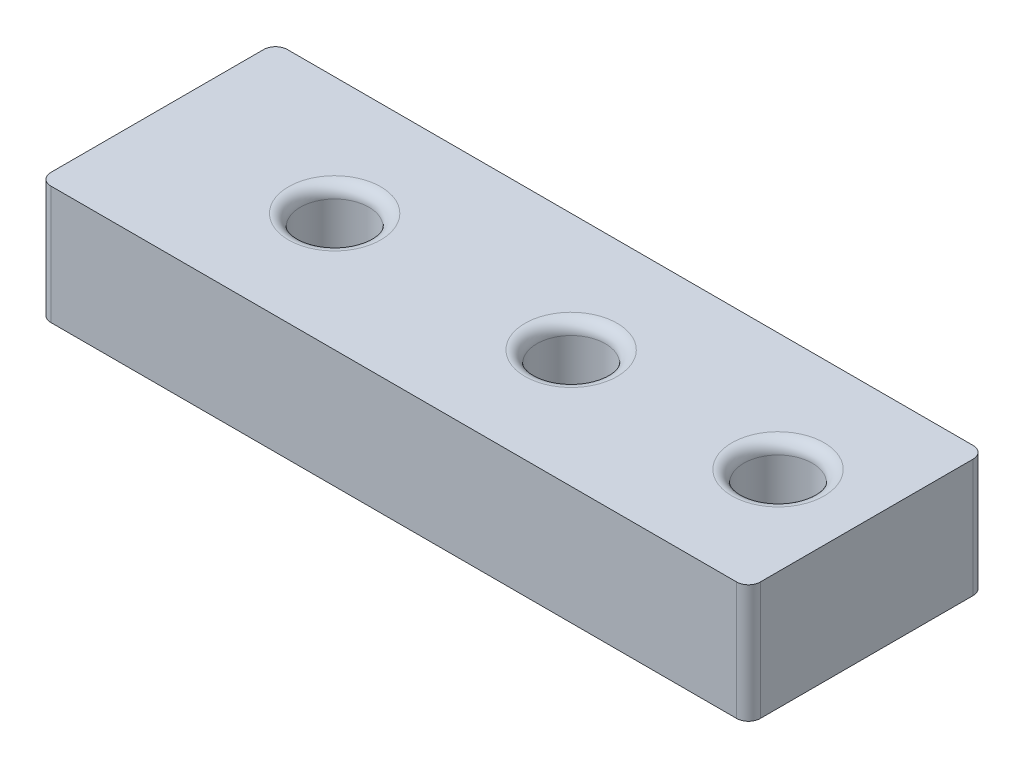
ISO-10303-21;
HEADER;
FILE_DESCRIPTION(('STEP AP214'),'2;1');
FILE_NAME('part.step','',(''),(''),'','','');
FILE_SCHEMA(('AUTOMOTIVE_DESIGN { 1 0 10303 214 1 1 1 1 }'));
ENDSEC;
DATA;
#1=APPLICATION_CONTEXT('core data for automotive mechanical design processes');
#2=APPLICATION_PROTOCOL_DEFINITION('international standard','automotive_design',2000,#1);
#3=PRODUCT_CONTEXT('',#1,'mechanical');
#4=PRODUCT('Part','Part','',(#3));
#5=PRODUCT_RELATED_PRODUCT_CATEGORY('part','',(#4));
#6=PRODUCT_DEFINITION_FORMATION('','',#4);
#7=PRODUCT_DEFINITION_CONTEXT('part definition',#1,'design');
#8=PRODUCT_DEFINITION('design','',#6,#7);
#9=PRODUCT_DEFINITION_SHAPE('','',#8);
#10=(LENGTH_UNIT() NAMED_UNIT(*) SI_UNIT(.MILLI.,.METRE.));
#11=(NAMED_UNIT(*) PLANE_ANGLE_UNIT() SI_UNIT($,.RADIAN.));
#12=(NAMED_UNIT(*) SI_UNIT($,.STERADIAN.) SOLID_ANGLE_UNIT());
#13=UNCERTAINTY_MEASURE_WITH_UNIT(LENGTH_MEASURE(1.E-05),#10,'distance_accuracy_value','');
#14=(GEOMETRIC_REPRESENTATION_CONTEXT(3) GLOBAL_UNCERTAINTY_ASSIGNED_CONTEXT((#13)) GLOBAL_UNIT_ASSIGNED_CONTEXT((#10,
#11,#12)) REPRESENTATION_CONTEXT('',''));
#15=CARTESIAN_POINT('',(0.,0.,0.));
#16=DIRECTION('',(0.,0.,1.));
#17=DIRECTION('',(1.,0.,0.));
#18=AXIS2_PLACEMENT_3D('',#15,#16,#17);
#19=CARTESIAN_POINT('',(38.1,12.7,-12.7));
#20=DIRECTION('',(-1.,0.,0.));
#21=DIRECTION('',(0.,0.,1.));
#22=AXIS2_PLACEMENT_3D('',#19,#20,#21);
#23=PLANE('',#22);
#24=DIRECTION('',(0.,0.,-1.));
#25=VECTOR('',#24,1.);
#26=CARTESIAN_POINT('',(38.1,0.,-12.7));
#27=LINE('',#26,#25);
#28=CARTESIAN_POINT('',(38.1,0.,11.43));
#29=VERTEX_POINT('',#28);
#30=CARTESIAN_POINT('',(38.1,0.,-11.43));
#31=VERTEX_POINT('',#30);
#32=EDGE_CURVE('E208',#29,#31,#27,.T.);
#33=ORIENTED_EDGE('',*,*,#32,.T.);
#34=DIRECTION('',(0.,-1.,0.));
#35=VECTOR('',#34,1.);
#36=CARTESIAN_POINT('',(38.1,12.7,-11.43));
#37=LINE('',#36,#35);
#38=CARTESIAN_POINT('',(38.1,12.7,-11.43));
#39=VERTEX_POINT('',#38);
#40=EDGE_CURVE('E119',#31,#39,#37,.F.);
#41=ORIENTED_EDGE('',*,*,#40,.T.);
#42=DIRECTION('',(0.,0.,-1.));
#43=VECTOR('',#42,1.);
#44=CARTESIAN_POINT('',(38.1,12.7,-12.7));
#45=LINE('',#44,#43);
#46=CARTESIAN_POINT('',(38.1,12.7,11.43));
#47=VERTEX_POINT('',#46);
#48=EDGE_CURVE('E104',#47,#39,#45,.T.);
#49=ORIENTED_EDGE('',*,*,#48,.F.);
#50=DIRECTION('',(0.,-1.,0.));
#51=VECTOR('',#50,1.);
#52=CARTESIAN_POINT('',(38.1,12.7,11.43));
#53=LINE('',#52,#51);
#54=EDGE_CURVE('E117',#47,#29,#53,.T.);
#55=ORIENTED_EDGE('',*,*,#54,.T.);
#56=EDGE_LOOP('',(#33,#41,#49,#55));
#57=FACE_BOUND('',#56,.T.);
#58=ADVANCED_FACE('F33',(#57),#23,.F.);
#59=CARTESIAN_POINT('',(-38.1,12.7,-12.7));
#60=DIRECTION('',(0.,0.,1.));
#61=DIRECTION('',(1.,0.,0.));
#62=AXIS2_PLACEMENT_3D('',#59,#60,#61);
#63=PLANE('',#62);
#64=DIRECTION('',(-1.,0.,0.));
#65=VECTOR('',#64,1.);
#66=CARTESIAN_POINT('',(-38.1,12.7,-12.7));
#67=LINE('',#66,#65);
#68=CARTESIAN_POINT('',(36.83,12.7,-12.7));
#69=VERTEX_POINT('',#68);
#70=CARTESIAN_POINT('',(-36.83,12.7,-12.7));
#71=VERTEX_POINT('',#70);
#72=EDGE_CURVE('E120',#69,#71,#67,.T.);
#73=ORIENTED_EDGE('',*,*,#72,.F.);
#74=DIRECTION('',(0.,-1.,0.));
#75=VECTOR('',#74,1.);
#76=CARTESIAN_POINT('',(36.83,12.7,-12.7));
#77=LINE('',#76,#75);
#78=CARTESIAN_POINT('',(36.83,0.,-12.7));
#79=VERTEX_POINT('',#78);
#80=EDGE_CURVE('E125',#69,#79,#77,.T.);
#81=ORIENTED_EDGE('',*,*,#80,.T.);
#82=DIRECTION('',(-1.,0.,0.));
#83=VECTOR('',#82,1.);
#84=CARTESIAN_POINT('',(-38.1,0.,-12.7));
#85=LINE('',#84,#83);
#86=CARTESIAN_POINT('',(-36.83,0.,-12.7));
#87=VERTEX_POINT('',#86);
#88=EDGE_CURVE('E199',#79,#87,#85,.T.);
#89=ORIENTED_EDGE('',*,*,#88,.T.);
#90=DIRECTION('',(0.,-1.,0.));
#91=VECTOR('',#90,1.);
#92=CARTESIAN_POINT('',(-36.83,12.7,-12.7));
#93=LINE('',#92,#91);
#94=EDGE_CURVE('E129',#87,#71,#93,.F.);
#95=ORIENTED_EDGE('',*,*,#94,.T.);
#96=EDGE_LOOP('',(#73,#81,#89,#95));
#97=FACE_BOUND('',#96,.T.);
#98=ADVANCED_FACE('F198',(#97),#63,.F.);
#99=CARTESIAN_POINT('',(-38.1,12.7,-12.7));
#100=DIRECTION('',(1.,0.,0.));
#101=DIRECTION('',(0.,0.,-1.));
#102=AXIS2_PLACEMENT_3D('',#99,#100,#101);
#103=PLANE('',#102);
#104=DIRECTION('',(0.,0.,1.));
#105=VECTOR('',#104,1.);
#106=CARTESIAN_POINT('',(-38.1,12.7,-12.7));
#107=LINE('',#106,#105);
#108=CARTESIAN_POINT('',(-38.1,12.7,-11.43));
#109=VERTEX_POINT('',#108);
#110=CARTESIAN_POINT('',(-38.1,12.7,11.43));
#111=VERTEX_POINT('',#110);
#112=EDGE_CURVE('E142',#109,#111,#107,.T.);
#113=ORIENTED_EDGE('',*,*,#112,.F.);
#114=DIRECTION('',(0.,-1.,0.));
#115=VECTOR('',#114,1.);
#116=CARTESIAN_POINT('',(-38.1,12.7,-11.43));
#117=LINE('',#116,#115);
#118=CARTESIAN_POINT('',(-38.1,0.,-11.43));
#119=VERTEX_POINT('',#118);
#120=EDGE_CURVE('E11',#109,#119,#117,.T.);
#121=ORIENTED_EDGE('',*,*,#120,.T.);
#122=DIRECTION('',(0.,0.,1.));
#123=VECTOR('',#122,1.);
#124=CARTESIAN_POINT('',(-38.1,0.,-12.7));
#125=LINE('',#124,#123);
#126=CARTESIAN_POINT('',(-38.1,0.,11.43));
#127=VERTEX_POINT('',#126);
#128=EDGE_CURVE('E144',#119,#127,#125,.T.);
#129=ORIENTED_EDGE('',*,*,#128,.T.);
#130=DIRECTION('',(0.,-1.,0.));
#131=VECTOR('',#130,1.);
#132=CARTESIAN_POINT('',(-38.1,12.7,11.43));
#133=LINE('',#132,#131);
#134=EDGE_CURVE('E41',#127,#111,#133,.F.);
#135=ORIENTED_EDGE('',*,*,#134,.T.);
#136=EDGE_LOOP('',(#113,#121,#129,#135));
#137=FACE_BOUND('',#136,.T.);
#138=ADVANCED_FACE('F141',(#137),#103,.F.);
#139=CARTESIAN_POINT('',(-38.1,12.7,12.7));
#140=DIRECTION('',(0.,0.,-1.));
#141=DIRECTION('',(-1.,0.,0.));
#142=AXIS2_PLACEMENT_3D('',#139,#140,#141);
#143=PLANE('',#142);
#144=DIRECTION('',(1.,0.,0.));
#145=VECTOR('',#144,1.);
#146=CARTESIAN_POINT('',(-38.1,0.,12.7));
#147=LINE('',#146,#145);
#148=CARTESIAN_POINT('',(-36.83,0.,12.7));
#149=VERTEX_POINT('',#148);
#150=CARTESIAN_POINT('',(36.83,0.,12.7));
#151=VERTEX_POINT('',#150);
#152=EDGE_CURVE('E121',#149,#151,#147,.T.);
#153=ORIENTED_EDGE('',*,*,#152,.T.);
#154=DIRECTION('',(0.,-1.,0.));
#155=VECTOR('',#154,1.);
#156=CARTESIAN_POINT('',(36.83,12.7,12.7));
#157=LINE('',#156,#155);
#158=CARTESIAN_POINT('',(36.83,12.7,12.7));
#159=VERTEX_POINT('',#158);
#160=EDGE_CURVE('E135',#151,#159,#157,.F.);
#161=ORIENTED_EDGE('',*,*,#160,.T.);
#162=DIRECTION('',(1.,0.,0.));
#163=VECTOR('',#162,1.);
#164=CARTESIAN_POINT('',(-38.1,12.7,12.7));
#165=LINE('',#164,#163);
#166=CARTESIAN_POINT('',(-36.83,12.7,12.7));
#167=VERTEX_POINT('',#166);
#168=EDGE_CURVE('E107',#167,#159,#165,.T.);
#169=ORIENTED_EDGE('',*,*,#168,.F.);
#170=DIRECTION('',(0.,-1.,0.));
#171=VECTOR('',#170,1.);
#172=CARTESIAN_POINT('',(-36.83,12.7,12.7));
#173=LINE('',#172,#171);
#174=EDGE_CURVE('E127',#167,#149,#173,.T.);
#175=ORIENTED_EDGE('',*,*,#174,.T.);
#176=EDGE_LOOP('',(#153,#161,#169,#175));
#177=FACE_BOUND('',#176,.T.);
#178=ADVANCED_FACE('F278',(#177),#143,.F.);
#179=CARTESIAN_POINT('',(0.,12.7,0.));
#180=DIRECTION('',(0.,1.,0.));
#181=DIRECTION('',(0.,0.,1.));
#182=AXIS2_PLACEMENT_3D('',#179,#180,#181);
#183=PLANE('',#182);
#184=CARTESIAN_POINT('',(-19.05,12.7,0.));
#185=DIRECTION('',(0.,1.,0.));
#186=DIRECTION('',(0.,0.,1.));
#187=AXIS2_PLACEMENT_3D('',#184,#185,#186);
#188=CIRCLE('',#187,4.95299999999999);
#189=CARTESIAN_POINT('',(-19.05,12.7,4.95299999999999));
#190=VERTEX_POINT('',#189);
#191=EDGE_CURVE('E167',#190,#190,#188,.F.);
#192=ORIENTED_EDGE('',*,*,#191,.T.);
#193=EDGE_LOOP('',(#192));
#194=FACE_BOUND('',#193,.T.);
#195=CARTESIAN_POINT('',(6.35,12.7,0.));
#196=DIRECTION('',(0.,1.,0.));
#197=DIRECTION('',(0.,0.,1.));
#198=AXIS2_PLACEMENT_3D('',#195,#196,#197);
#199=CIRCLE('',#198,4.95299999999999);
#200=CARTESIAN_POINT('',(6.35,12.7,4.95299999999999));
#201=VERTEX_POINT('',#200);
#202=EDGE_CURVE('E164',#201,#201,#199,.F.);
#203=ORIENTED_EDGE('',*,*,#202,.T.);
#204=EDGE_LOOP('',(#203));
#205=FACE_BOUND('',#204,.T.);
#206=CARTESIAN_POINT('',(28.575,12.7,0.));
#207=DIRECTION('',(0.,1.,0.));
#208=DIRECTION('',(0.,0.,1.));
#209=AXIS2_PLACEMENT_3D('',#206,#207,#208);
#210=CIRCLE('',#209,4.95299999999999);
#211=CARTESIAN_POINT('',(28.575,12.7,4.95299999999999));
#212=VERTEX_POINT('',#211);
#213=EDGE_CURVE('E161',#212,#212,#210,.F.);
#214=ORIENTED_EDGE('',*,*,#213,.T.);
#215=EDGE_LOOP('',(#214));
#216=FACE_BOUND('',#215,.T.);
#217=ORIENTED_EDGE('',*,*,#48,.T.);
#218=CARTESIAN_POINT('',(36.83,12.7,-11.43));
#219=DIRECTION('',(0.,1.,0.));
#220=DIRECTION('',(0.,0.,1.));
#221=AXIS2_PLACEMENT_3D('',#218,#219,#220);
#222=CIRCLE('',#221,1.27);
#223=EDGE_CURVE('E111',#39,#69,#222,.T.);
#224=ORIENTED_EDGE('',*,*,#223,.T.);
#225=ORIENTED_EDGE('',*,*,#72,.T.);
#226=CARTESIAN_POINT('',(-36.83,12.7,-11.43));
#227=DIRECTION('',(0.,1.,0.));
#228=DIRECTION('',(0.,0.,1.));
#229=AXIS2_PLACEMENT_3D('',#226,#227,#228);
#230=CIRCLE('',#229,1.27);
#231=EDGE_CURVE('E112',#71,#109,#230,.T.);
#232=ORIENTED_EDGE('',*,*,#231,.T.);
#233=ORIENTED_EDGE('',*,*,#112,.T.);
#234=CARTESIAN_POINT('',(-36.83,12.7,11.43));
#235=DIRECTION('',(0.,1.,0.));
#236=DIRECTION('',(0.,0.,1.));
#237=AXIS2_PLACEMENT_3D('',#234,#235,#236);
#238=CIRCLE('',#237,1.27);
#239=EDGE_CURVE('E147',#111,#167,#238,.T.);
#240=ORIENTED_EDGE('',*,*,#239,.T.);
#241=ORIENTED_EDGE('',*,*,#168,.T.);
#242=CARTESIAN_POINT('',(36.83,12.7,11.43));
#243=DIRECTION('',(0.,1.,0.));
#244=DIRECTION('',(0.,0.,1.));
#245=AXIS2_PLACEMENT_3D('',#242,#243,#244);
#246=CIRCLE('',#245,1.27);
#247=EDGE_CURVE('E101',#159,#47,#246,.T.);
#248=ORIENTED_EDGE('',*,*,#247,.T.);
#249=EDGE_LOOP('',(#217,#224,#225,#232,#233,#240,#241,#248));
#250=FACE_BOUND('',#249,.T.);
#251=ADVANCED_FACE('F103',(#194,#205,#216,#250),#183,.T.);
#252=CARTESIAN_POINT('',(0.,0.,0.));
#253=DIRECTION('',(0.,1.,0.));
#254=DIRECTION('',(0.,0.,1.));
#255=AXIS2_PLACEMENT_3D('',#252,#253,#254);
#256=PLANE('',#255);
#257=CARTESIAN_POINT('',(-19.05,0.,0.));
#258=DIRECTION('',(0.,1.,0.));
#259=DIRECTION('',(0.,0.,1.));
#260=AXIS2_PLACEMENT_3D('',#257,#258,#259);
#261=CIRCLE('',#260,4.95299999999999);
#262=CARTESIAN_POINT('',(-19.05,0.,4.95299999999999));
#263=VERTEX_POINT('',#262);
#264=EDGE_CURVE('E181',#263,#263,#261,.T.);
#265=ORIENTED_EDGE('',*,*,#264,.T.);
#266=EDGE_LOOP('',(#265));
#267=FACE_BOUND('',#266,.T.);
#268=CARTESIAN_POINT('',(6.35,0.,0.));
#269=DIRECTION('',(0.,1.,0.));
#270=DIRECTION('',(0.,0.,1.));
#271=AXIS2_PLACEMENT_3D('',#268,#269,#270);
#272=CIRCLE('',#271,4.95299999999999);
#273=CARTESIAN_POINT('',(6.35,0.,4.95299999999999));
#274=VERTEX_POINT('',#273);
#275=EDGE_CURVE('E178',#274,#274,#272,.T.);
#276=ORIENTED_EDGE('',*,*,#275,.T.);
#277=EDGE_LOOP('',(#276));
#278=FACE_BOUND('',#277,.T.);
#279=CARTESIAN_POINT('',(28.575,0.,0.));
#280=DIRECTION('',(0.,1.,0.));
#281=DIRECTION('',(0.,0.,1.));
#282=AXIS2_PLACEMENT_3D('',#279,#280,#281);
#283=CIRCLE('',#282,4.95299999999999);
#284=CARTESIAN_POINT('',(28.575,0.,4.95299999999999));
#285=VERTEX_POINT('',#284);
#286=EDGE_CURVE('E175',#285,#285,#283,.T.);
#287=ORIENTED_EDGE('',*,*,#286,.T.);
#288=EDGE_LOOP('',(#287));
#289=FACE_BOUND('',#288,.T.);
#290=ORIENTED_EDGE('',*,*,#88,.F.);
#291=CARTESIAN_POINT('',(36.83,0.,-11.43));
#292=DIRECTION('',(0.,1.,0.));
#293=DIRECTION('',(0.,0.,1.));
#294=AXIS2_PLACEMENT_3D('',#291,#292,#293);
#295=CIRCLE('',#294,1.27);
#296=EDGE_CURVE('E56',#79,#31,#295,.F.);
#297=ORIENTED_EDGE('',*,*,#296,.T.);
#298=ORIENTED_EDGE('',*,*,#32,.F.);
#299=CARTESIAN_POINT('',(36.83,0.,11.43));
#300=DIRECTION('',(0.,1.,0.));
#301=DIRECTION('',(0.,0.,1.));
#302=AXIS2_PLACEMENT_3D('',#299,#300,#301);
#303=CIRCLE('',#302,1.27);
#304=EDGE_CURVE('E124',#29,#151,#303,.F.);
#305=ORIENTED_EDGE('',*,*,#304,.T.);
#306=ORIENTED_EDGE('',*,*,#152,.F.);
#307=CARTESIAN_POINT('',(-36.83,0.,11.43));
#308=DIRECTION('',(0.,1.,0.));
#309=DIRECTION('',(0.,0.,1.));
#310=AXIS2_PLACEMENT_3D('',#307,#308,#309);
#311=CIRCLE('',#310,1.27);
#312=EDGE_CURVE('E170',#149,#127,#311,.F.);
#313=ORIENTED_EDGE('',*,*,#312,.T.);
#314=ORIENTED_EDGE('',*,*,#128,.F.);
#315=CARTESIAN_POINT('',(-36.83,0.,-11.43));
#316=DIRECTION('',(0.,1.,0.));
#317=DIRECTION('',(0.,0.,1.));
#318=AXIS2_PLACEMENT_3D('',#315,#316,#317);
#319=CIRCLE('',#318,1.27);
#320=EDGE_CURVE('E48',#119,#87,#319,.F.);
#321=ORIENTED_EDGE('',*,*,#320,.T.);
#322=EDGE_LOOP('',(#290,#297,#298,#305,#306,#313,#314,#321));
#323=FACE_BOUND('',#322,.T.);
#324=ADVANCED_FACE('F203',(#267,#278,#289,#323),#256,.F.);
#325=CARTESIAN_POINT('',(6.35,12.7,0.));
#326=DIRECTION('',(0.,1.,0.));
#327=DIRECTION('',(0.,0.,1.));
#328=AXIS2_PLACEMENT_3D('',#325,#326,#327);
#329=CYLINDRICAL_SURFACE('',#328,3.68299999999999);
#330=CARTESIAN_POINT('',(6.35,11.43,0.));
#331=DIRECTION('',(0.,1.,0.));
#332=DIRECTION('',(0.,0.,1.));
#333=AXIS2_PLACEMENT_3D('',#330,#331,#332);
#334=CIRCLE('',#333,3.68299999999999);
#335=CARTESIAN_POINT('',(6.35,11.43,3.68299999999999));
#336=VERTEX_POINT('',#335);
#337=EDGE_CURVE('E187',#336,#336,#334,.T.);
#338=ORIENTED_EDGE('',*,*,#337,.T.);
#339=EDGE_LOOP('',(#338));
#340=FACE_BOUND('',#339,.T.);
#341=CARTESIAN_POINT('',(6.35,1.27,0.));
#342=DIRECTION('',(0.,1.,0.));
#343=DIRECTION('',(0.,0.,1.));
#344=AXIS2_PLACEMENT_3D('',#341,#342,#343);
#345=CIRCLE('',#344,3.68299999999999);
#346=CARTESIAN_POINT('',(6.35,1.27,3.68299999999999));
#347=VERTEX_POINT('',#346);
#348=EDGE_CURVE('E184',#347,#347,#345,.F.);
#349=ORIENTED_EDGE('',*,*,#348,.T.);
#350=EDGE_LOOP('',(#349));
#351=FACE_BOUND('',#350,.T.);
#352=ADVANCED_FACE('F269',(#340,#351),#329,.F.);
#353=CARTESIAN_POINT('',(-19.05,12.7,0.));
#354=DIRECTION('',(0.,1.,0.));
#355=DIRECTION('',(0.,0.,1.));
#356=AXIS2_PLACEMENT_3D('',#353,#354,#355);
#357=CYLINDRICAL_SURFACE('',#356,3.68299999999999);
#358=CARTESIAN_POINT('',(-19.05,11.43,0.));
#359=DIRECTION('',(0.,1.,0.));
#360=DIRECTION('',(0.,0.,1.));
#361=AXIS2_PLACEMENT_3D('',#358,#359,#360);
#362=CIRCLE('',#361,3.68299999999999);
#363=CARTESIAN_POINT('',(-19.05,11.43,3.68299999999999));
#364=VERTEX_POINT('',#363);
#365=EDGE_CURVE('E152',#364,#364,#362,.T.);
#366=ORIENTED_EDGE('',*,*,#365,.T.);
#367=EDGE_LOOP('',(#366));
#368=FACE_BOUND('',#367,.T.);
#369=CARTESIAN_POINT('',(-19.05,1.27,0.));
#370=DIRECTION('',(0.,1.,0.));
#371=DIRECTION('',(0.,0.,1.));
#372=AXIS2_PLACEMENT_3D('',#369,#370,#371);
#373=CIRCLE('',#372,3.68299999999999);
#374=CARTESIAN_POINT('',(-19.05,1.27,3.68299999999999));
#375=VERTEX_POINT('',#374);
#376=EDGE_CURVE('E156',#375,#375,#373,.F.);
#377=ORIENTED_EDGE('',*,*,#376,.T.);
#378=EDGE_LOOP('',(#377));
#379=FACE_BOUND('',#378,.T.);
#380=ADVANCED_FACE('F262',(#368,#379),#357,.F.);
#381=CARTESIAN_POINT('',(28.575,12.7,0.));
#382=DIRECTION('',(0.,1.,0.));
#383=DIRECTION('',(0.,0.,1.));
#384=AXIS2_PLACEMENT_3D('',#381,#382,#383);
#385=CYLINDRICAL_SURFACE('',#384,3.68299999999999);
#386=CARTESIAN_POINT('',(28.575,11.43,0.));
#387=DIRECTION('',(0.,1.,0.));
#388=DIRECTION('',(0.,0.,1.));
#389=AXIS2_PLACEMENT_3D('',#386,#387,#388);
#390=CIRCLE('',#389,3.68299999999999);
#391=CARTESIAN_POINT('',(28.575,11.43,3.68299999999999));
#392=VERTEX_POINT('',#391);
#393=EDGE_CURVE('E193',#392,#392,#390,.T.);
#394=ORIENTED_EDGE('',*,*,#393,.T.);
#395=EDGE_LOOP('',(#394));
#396=FACE_BOUND('',#395,.T.);
#397=CARTESIAN_POINT('',(28.575,1.27,0.));
#398=DIRECTION('',(0.,1.,0.));
#399=DIRECTION('',(0.,0.,1.));
#400=AXIS2_PLACEMENT_3D('',#397,#398,#399);
#401=CIRCLE('',#400,3.68299999999999);
#402=CARTESIAN_POINT('',(28.575,1.27,3.68299999999999));
#403=VERTEX_POINT('',#402);
#404=EDGE_CURVE('E190',#403,#403,#401,.F.);
#405=ORIENTED_EDGE('',*,*,#404,.T.);
#406=EDGE_LOOP('',(#405));
#407=FACE_BOUND('',#406,.T.);
#408=ADVANCED_FACE('F239',(#396,#407),#385,.F.);
#409=CARTESIAN_POINT('',(-19.05,11.43,0.));
#410=DIRECTION('',(0.,1.,0.));
#411=DIRECTION('',(0.,0.,1.));
#412=AXIS2_PLACEMENT_3D('',#409,#410,#411);
#413=TOROIDAL_SURFACE('',#412,4.95299999999999,1.27);
#414=ORIENTED_EDGE('',*,*,#191,.F.);
#415=EDGE_LOOP('',(#414));
#416=FACE_BOUND('',#415,.T.);
#417=ORIENTED_EDGE('',*,*,#365,.F.);
#418=EDGE_LOOP('',(#417));
#419=FACE_BOUND('',#418,.T.);
#420=ADVANCED_FACE('F235',(#416,#419),#413,.T.);
#421=CARTESIAN_POINT('',(-19.05,1.27,0.));
#422=DIRECTION('',(0.,1.,0.));
#423=DIRECTION('',(0.,0.,1.));
#424=AXIS2_PLACEMENT_3D('',#421,#422,#423);
#425=TOROIDAL_SURFACE('',#424,4.95299999999999,1.27);
#426=ORIENTED_EDGE('',*,*,#376,.F.);
#427=EDGE_LOOP('',(#426));
#428=FACE_BOUND('',#427,.T.);
#429=ORIENTED_EDGE('',*,*,#264,.F.);
#430=EDGE_LOOP('',(#429));
#431=FACE_BOUND('',#430,.T.);
#432=ADVANCED_FACE('F238',(#428,#431),#425,.T.);
#433=CARTESIAN_POINT('',(6.35,11.43,0.));
#434=DIRECTION('',(0.,1.,0.));
#435=DIRECTION('',(0.,0.,1.));
#436=AXIS2_PLACEMENT_3D('',#433,#434,#435);
#437=TOROIDAL_SURFACE('',#436,4.95299999999999,1.27);
#438=ORIENTED_EDGE('',*,*,#202,.F.);
#439=EDGE_LOOP('',(#438));
#440=FACE_BOUND('',#439,.T.);
#441=ORIENTED_EDGE('',*,*,#337,.F.);
#442=EDGE_LOOP('',(#441));
#443=FACE_BOUND('',#442,.T.);
#444=ADVANCED_FACE('F243',(#440,#443),#437,.T.);
#445=CARTESIAN_POINT('',(6.35,1.27,0.));
#446=DIRECTION('',(0.,1.,0.));
#447=DIRECTION('',(0.,0.,1.));
#448=AXIS2_PLACEMENT_3D('',#445,#446,#447);
#449=TOROIDAL_SURFACE('',#448,4.95299999999999,1.27);
#450=ORIENTED_EDGE('',*,*,#348,.F.);
#451=EDGE_LOOP('',(#450));
#452=FACE_BOUND('',#451,.T.);
#453=ORIENTED_EDGE('',*,*,#275,.F.);
#454=EDGE_LOOP('',(#453));
#455=FACE_BOUND('',#454,.T.);
#456=ADVANCED_FACE('F247',(#452,#455),#449,.T.);
#457=CARTESIAN_POINT('',(28.575,11.43,0.));
#458=DIRECTION('',(0.,1.,0.));
#459=DIRECTION('',(0.,0.,1.));
#460=AXIS2_PLACEMENT_3D('',#457,#458,#459);
#461=TOROIDAL_SURFACE('',#460,4.95299999999999,1.27);
#462=ORIENTED_EDGE('',*,*,#213,.F.);
#463=EDGE_LOOP('',(#462));
#464=FACE_BOUND('',#463,.T.);
#465=ORIENTED_EDGE('',*,*,#393,.F.);
#466=EDGE_LOOP('',(#465));
#467=FACE_BOUND('',#466,.T.);
#468=ADVANCED_FACE('F224',(#464,#467),#461,.T.);
#469=CARTESIAN_POINT('',(28.575,1.27,0.));
#470=DIRECTION('',(0.,1.,0.));
#471=DIRECTION('',(0.,0.,1.));
#472=AXIS2_PLACEMENT_3D('',#469,#470,#471);
#473=TOROIDAL_SURFACE('',#472,4.95299999999999,1.27);
#474=ORIENTED_EDGE('',*,*,#404,.F.);
#475=EDGE_LOOP('',(#474));
#476=FACE_BOUND('',#475,.T.);
#477=ORIENTED_EDGE('',*,*,#286,.F.);
#478=EDGE_LOOP('',(#477));
#479=FACE_BOUND('',#478,.T.);
#480=ADVANCED_FACE('F217',(#476,#479),#473,.T.);
#481=CARTESIAN_POINT('',(36.83,12.7,-11.43));
#482=DIRECTION('',(0.,-1.,0.));
#483=DIRECTION('',(0.,0.,-1.));
#484=AXIS2_PLACEMENT_3D('',#481,#482,#483);
#485=CYLINDRICAL_SURFACE('',#484,1.27);
#486=ORIENTED_EDGE('',*,*,#223,.F.);
#487=ORIENTED_EDGE('',*,*,#40,.F.);
#488=ORIENTED_EDGE('',*,*,#296,.F.);
#489=ORIENTED_EDGE('',*,*,#80,.F.);
#490=EDGE_LOOP('',(#486,#487,#488,#489));
#491=FACE_BOUND('',#490,.T.);
#492=ADVANCED_FACE('F215',(#491),#485,.T.);
#493=CARTESIAN_POINT('',(36.83,12.7,11.43));
#494=DIRECTION('',(0.,-1.,0.));
#495=DIRECTION('',(0.,0.,-1.));
#496=AXIS2_PLACEMENT_3D('',#493,#494,#495);
#497=CYLINDRICAL_SURFACE('',#496,1.27);
#498=ORIENTED_EDGE('',*,*,#247,.F.);
#499=ORIENTED_EDGE('',*,*,#160,.F.);
#500=ORIENTED_EDGE('',*,*,#304,.F.);
#501=ORIENTED_EDGE('',*,*,#54,.F.);
#502=EDGE_LOOP('',(#498,#499,#500,#501));
#503=FACE_BOUND('',#502,.T.);
#504=ADVANCED_FACE('F123',(#503),#497,.T.);
#505=CARTESIAN_POINT('',(-36.83,12.7,-11.43));
#506=DIRECTION('',(0.,-1.,0.));
#507=DIRECTION('',(0.,0.,-1.));
#508=AXIS2_PLACEMENT_3D('',#505,#506,#507);
#509=CYLINDRICAL_SURFACE('',#508,1.27);
#510=ORIENTED_EDGE('',*,*,#231,.F.);
#511=ORIENTED_EDGE('',*,*,#94,.F.);
#512=ORIENTED_EDGE('',*,*,#320,.F.);
#513=ORIENTED_EDGE('',*,*,#120,.F.);
#514=EDGE_LOOP('',(#510,#511,#512,#513));
#515=FACE_BOUND('',#514,.T.);
#516=ADVANCED_FACE('F202',(#515),#509,.T.);
#517=CARTESIAN_POINT('',(-36.83,12.7,11.43));
#518=DIRECTION('',(0.,-1.,0.));
#519=DIRECTION('',(0.,0.,-1.));
#520=AXIS2_PLACEMENT_3D('',#517,#518,#519);
#521=CYLINDRICAL_SURFACE('',#520,1.27);
#522=ORIENTED_EDGE('',*,*,#239,.F.);
#523=ORIENTED_EDGE('',*,*,#134,.F.);
#524=ORIENTED_EDGE('',*,*,#312,.F.);
#525=ORIENTED_EDGE('',*,*,#174,.F.);
#526=EDGE_LOOP('',(#522,#523,#524,#525));
#527=FACE_BOUND('',#526,.T.);
#528=ADVANCED_FACE('F35',(#527),#521,.T.);
#529=CLOSED_SHELL('',(#58,#98,#138,#178,#251,#324,#352,#380,#408,#420,#432,#444,#456,#468,#480,
#492,#504,#516,#528));
#530=MANIFOLD_SOLID_BREP('B2',#529);
#531=ADVANCED_BREP_SHAPE_REPRESENTATION('',(#18,#530),#14);
#532=SHAPE_DEFINITION_REPRESENTATION(#9,#531);
ENDSEC;
END-ISO-10303-21;
